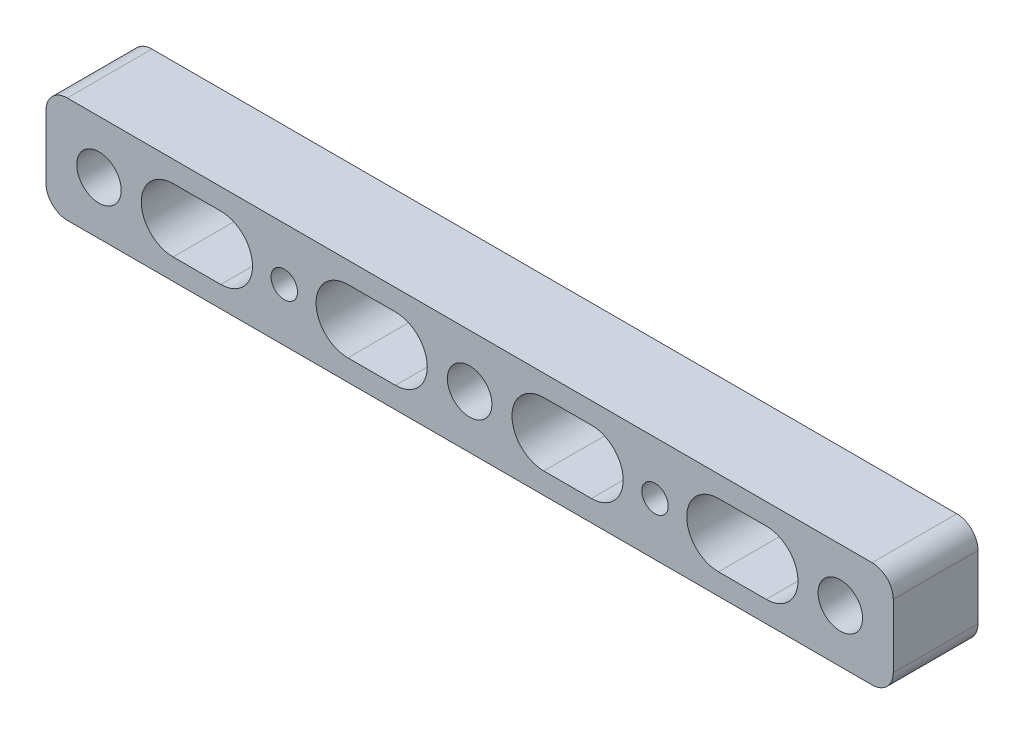
ISO-10303-21;
HEADER;
FILE_DESCRIPTION(('STEP AP214'),'2;1');
FILE_NAME('part.step','',(''),(''),'','','');
FILE_SCHEMA(('AUTOMOTIVE_DESIGN { 1 0 10303 214 1 1 1 1 }'));
ENDSEC;
DATA;
#1=APPLICATION_CONTEXT('core data for automotive mechanical design processes');
#2=APPLICATION_PROTOCOL_DEFINITION('international standard','automotive_design',2000,#1);
#3=PRODUCT_CONTEXT('',#1,'mechanical');
#4=PRODUCT('Part','Part','',(#3));
#5=PRODUCT_RELATED_PRODUCT_CATEGORY('part','',(#4));
#6=PRODUCT_DEFINITION_FORMATION('','',#4);
#7=PRODUCT_DEFINITION_CONTEXT('part definition',#1,'design');
#8=PRODUCT_DEFINITION('design','',#6,#7);
#9=PRODUCT_DEFINITION_SHAPE('','',#8);
#10=(LENGTH_UNIT() NAMED_UNIT(*) SI_UNIT(.MILLI.,.METRE.));
#11=(NAMED_UNIT(*) PLANE_ANGLE_UNIT() SI_UNIT($,.RADIAN.));
#12=(NAMED_UNIT(*) SI_UNIT($,.STERADIAN.) SOLID_ANGLE_UNIT());
#13=UNCERTAINTY_MEASURE_WITH_UNIT(LENGTH_MEASURE(1.E-05),#10,'distance_accuracy_value','');
#14=(GEOMETRIC_REPRESENTATION_CONTEXT(3) GLOBAL_UNCERTAINTY_ASSIGNED_CONTEXT((#13)) GLOBAL_UNIT_ASSIGNED_CONTEXT((#10,
#11,#12)) REPRESENTATION_CONTEXT('',''));
#15=CARTESIAN_POINT('',(0.,0.,0.));
#16=DIRECTION('',(0.,0.,1.));
#17=DIRECTION('',(1.,0.,0.));
#18=AXIS2_PLACEMENT_3D('',#15,#16,#17);
#19=CARTESIAN_POINT('',(40.,-5.,8.));
#20=DIRECTION('',(-1.,0.,0.));
#21=DIRECTION('',(0.,0.,1.));
#22=AXIS2_PLACEMENT_3D('',#19,#20,#21);
#23=PLANE('',#22);
#24=DIRECTION('',(0.,1.,0.));
#25=VECTOR('',#24,1.);
#26=CARTESIAN_POINT('',(40.,-5.,8.));
#27=LINE('',#26,#25);
#28=CARTESIAN_POINT('',(40.,-3.,8.));
#29=VERTEX_POINT('',#28);
#30=CARTESIAN_POINT('',(40.,3.,8.));
#31=VERTEX_POINT('',#30);
#32=EDGE_CURVE('E311',#29,#31,#27,.T.);
#33=ORIENTED_EDGE('',*,*,#32,.F.);
#34=DIRECTION('',(0.,0.,-1.));
#35=VECTOR('',#34,1.);
#36=CARTESIAN_POINT('',(40.,-3.,8.));
#37=LINE('',#36,#35);
#38=CARTESIAN_POINT('',(40.,-3.,0.));
#39=VERTEX_POINT('',#38);
#40=EDGE_CURVE('E345',#29,#39,#37,.T.);
#41=ORIENTED_EDGE('',*,*,#40,.T.);
#42=DIRECTION('',(0.,1.,0.));
#43=VECTOR('',#42,1.);
#44=CARTESIAN_POINT('',(40.,-5.,0.));
#45=LINE('',#44,#43);
#46=CARTESIAN_POINT('',(40.,3.,0.));
#47=VERTEX_POINT('',#46);
#48=EDGE_CURVE('E325',#39,#47,#45,.T.);
#49=ORIENTED_EDGE('',*,*,#48,.T.);
#50=DIRECTION('',(0.,0.,-1.));
#51=VECTOR('',#50,1.);
#52=CARTESIAN_POINT('',(40.,3.,8.));
#53=LINE('',#52,#51);
#54=EDGE_CURVE('E324',#47,#31,#53,.F.);
#55=ORIENTED_EDGE('',*,*,#54,.T.);
#56=EDGE_LOOP('',(#33,#41,#49,#55));
#57=FACE_BOUND('',#56,.T.);
#58=ADVANCED_FACE('F38',(#57),#23,.F.);
#59=CARTESIAN_POINT('',(-40.,5.,8.));
#60=DIRECTION('',(0.,-1.,0.));
#61=DIRECTION('',(0.,0.,-1.));
#62=AXIS2_PLACEMENT_3D('',#59,#60,#61);
#63=PLANE('',#62);
#64=DIRECTION('',(-1.,0.,0.));
#65=VECTOR('',#64,1.);
#66=CARTESIAN_POINT('',(-40.,5.,8.));
#67=LINE('',#66,#65);
#68=CARTESIAN_POINT('',(38.,5.,8.));
#69=VERTEX_POINT('',#68);
#70=CARTESIAN_POINT('',(-38.,5.,8.));
#71=VERTEX_POINT('',#70);
#72=EDGE_CURVE('E314',#69,#71,#67,.T.);
#73=ORIENTED_EDGE('',*,*,#72,.F.);
#74=DIRECTION('',(0.,0.,-1.));
#75=VECTOR('',#74,1.);
#76=CARTESIAN_POINT('',(38.,5.,8.));
#77=LINE('',#76,#75);
#78=CARTESIAN_POINT('',(38.,5.,0.));
#79=VERTEX_POINT('',#78);
#80=EDGE_CURVE('E371',#69,#79,#77,.T.);
#81=ORIENTED_EDGE('',*,*,#80,.T.);
#82=DIRECTION('',(-1.,0.,0.));
#83=VECTOR('',#82,1.);
#84=CARTESIAN_POINT('',(-40.,5.,0.));
#85=LINE('',#84,#83);
#86=CARTESIAN_POINT('',(-38.,5.,0.));
#87=VERTEX_POINT('',#86);
#88=EDGE_CURVE('E328',#79,#87,#85,.T.);
#89=ORIENTED_EDGE('',*,*,#88,.T.);
#90=DIRECTION('',(0.,0.,-1.));
#91=VECTOR('',#90,1.);
#92=CARTESIAN_POINT('',(-38.,5.,8.));
#93=LINE('',#92,#91);
#94=EDGE_CURVE('E369',#87,#71,#93,.F.);
#95=ORIENTED_EDGE('',*,*,#94,.T.);
#96=EDGE_LOOP('',(#73,#81,#89,#95));
#97=FACE_BOUND('',#96,.T.);
#98=ADVANCED_FACE('F431',(#97),#63,.F.);
#99=CARTESIAN_POINT('',(-40.,-5.,8.));
#100=DIRECTION('',(1.,0.,0.));
#101=DIRECTION('',(0.,0.,-1.));
#102=AXIS2_PLACEMENT_3D('',#99,#100,#101);
#103=PLANE('',#102);
#104=DIRECTION('',(0.,-1.,0.));
#105=VECTOR('',#104,1.);
#106=CARTESIAN_POINT('',(-40.,-5.,8.));
#107=LINE('',#106,#105);
#108=CARTESIAN_POINT('',(-40.,3.,8.));
#109=VERTEX_POINT('',#108);
#110=CARTESIAN_POINT('',(-40.,-3.,8.));
#111=VERTEX_POINT('',#110);
#112=EDGE_CURVE('E318',#109,#111,#107,.T.);
#113=ORIENTED_EDGE('',*,*,#112,.F.);
#114=DIRECTION('',(0.,0.,-1.));
#115=VECTOR('',#114,1.);
#116=CARTESIAN_POINT('',(-40.,3.,8.));
#117=LINE('',#116,#115);
#118=CARTESIAN_POINT('',(-40.,3.,0.));
#119=VERTEX_POINT('',#118);
#120=EDGE_CURVE('E376',#109,#119,#117,.T.);
#121=ORIENTED_EDGE('',*,*,#120,.T.);
#122=DIRECTION('',(0.,-1.,0.));
#123=VECTOR('',#122,1.);
#124=CARTESIAN_POINT('',(-40.,-5.,0.));
#125=LINE('',#124,#123);
#126=CARTESIAN_POINT('',(-40.,-3.,0.));
#127=VERTEX_POINT('',#126);
#128=EDGE_CURVE('E331',#119,#127,#125,.T.);
#129=ORIENTED_EDGE('',*,*,#128,.T.);
#130=DIRECTION('',(0.,0.,-1.));
#131=VECTOR('',#130,1.);
#132=CARTESIAN_POINT('',(-40.,-3.,8.));
#133=LINE('',#132,#131);
#134=EDGE_CURVE('E374',#127,#111,#133,.F.);
#135=ORIENTED_EDGE('',*,*,#134,.T.);
#136=EDGE_LOOP('',(#113,#121,#129,#135));
#137=FACE_BOUND('',#136,.T.);
#138=ADVANCED_FACE('F437',(#137),#103,.F.);
#139=CARTESIAN_POINT('',(-40.,-5.,8.));
#140=DIRECTION('',(0.,1.,0.));
#141=DIRECTION('',(0.,0.,1.));
#142=AXIS2_PLACEMENT_3D('',#139,#140,#141);
#143=PLANE('',#142);
#144=DIRECTION('',(1.,0.,0.));
#145=VECTOR('',#144,1.);
#146=CARTESIAN_POINT('',(-40.,-5.,0.));
#147=LINE('',#146,#145);
#148=CARTESIAN_POINT('',(-38.,-5.,0.));
#149=VERTEX_POINT('',#148);
#150=CARTESIAN_POINT('',(38.,-5.,0.));
#151=VERTEX_POINT('',#150);
#152=EDGE_CURVE('E315',#149,#151,#147,.T.);
#153=ORIENTED_EDGE('',*,*,#152,.T.);
#154=DIRECTION('',(0.,0.,-1.));
#155=VECTOR('',#154,1.);
#156=CARTESIAN_POINT('',(38.,-5.,8.));
#157=LINE('',#156,#155);
#158=CARTESIAN_POINT('',(38.,-5.,8.));
#159=VERTEX_POINT('',#158);
#160=EDGE_CURVE('E359',#151,#159,#157,.F.);
#161=ORIENTED_EDGE('',*,*,#160,.T.);
#162=DIRECTION('',(1.,0.,0.));
#163=VECTOR('',#162,1.);
#164=CARTESIAN_POINT('',(-40.,-5.,8.));
#165=LINE('',#164,#163);
#166=CARTESIAN_POINT('',(-38.,-5.,8.));
#167=VERTEX_POINT('',#166);
#168=EDGE_CURVE('E321',#167,#159,#165,.T.);
#169=ORIENTED_EDGE('',*,*,#168,.F.);
#170=DIRECTION('',(0.,0.,-1.));
#171=VECTOR('',#170,1.);
#172=CARTESIAN_POINT('',(-38.,-5.,8.));
#173=LINE('',#172,#171);
#174=EDGE_CURVE('E356',#167,#149,#173,.T.);
#175=ORIENTED_EDGE('',*,*,#174,.T.);
#176=EDGE_LOOP('',(#153,#161,#169,#175));
#177=FACE_BOUND('',#176,.T.);
#178=ADVANCED_FACE('F473',(#177),#143,.F.);
#179=CARTESIAN_POINT('',(0.,0.,8.));
#180=DIRECTION('',(0.,0.,-1.));
#181=DIRECTION('',(-1.,0.,0.));
#182=AXIS2_PLACEMENT_3D('',#179,#180,#181);
#183=PLANE('',#182);
#184=DIRECTION('',(1.,0.,0.));
#185=VECTOR('',#184,1.);
#186=CARTESIAN_POINT('',(-28.,-3.,8.));
#187=LINE('',#186,#185);
#188=CARTESIAN_POINT('',(-28.,-3.,8.));
#189=VERTEX_POINT('',#188);
#190=CARTESIAN_POINT('',(-23.5,-3.,8.));
#191=VERTEX_POINT('',#190);
#192=EDGE_CURVE('E215',#189,#191,#187,.T.);
#193=ORIENTED_EDGE('',*,*,#192,.F.);
#194=CARTESIAN_POINT('',(-28.,0.,8.));
#195=DIRECTION('',(0.,0.,1.));
#196=DIRECTION('',(1.,0.,0.));
#197=AXIS2_PLACEMENT_3D('',#194,#195,#196);
#198=CIRCLE('',#197,3.);
#199=CARTESIAN_POINT('',(-28.,3.,8.));
#200=VERTEX_POINT('',#199);
#201=EDGE_CURVE('E53',#200,#189,#198,.T.);
#202=ORIENTED_EDGE('',*,*,#201,.F.);
#203=DIRECTION('',(-1.,0.,0.));
#204=VECTOR('',#203,1.);
#205=CARTESIAN_POINT('',(-28.,3.,8.));
#206=LINE('',#205,#204);
#207=CARTESIAN_POINT('',(-23.5,3.,8.));
#208=VERTEX_POINT('',#207);
#209=EDGE_CURVE('E222',#208,#200,#206,.T.);
#210=ORIENTED_EDGE('',*,*,#209,.F.);
#211=CARTESIAN_POINT('',(-23.5,0.,8.));
#212=DIRECTION('',(0.,0.,1.));
#213=DIRECTION('',(1.,0.,0.));
#214=AXIS2_PLACEMENT_3D('',#211,#212,#213);
#215=CIRCLE('',#214,3.);
#216=EDGE_CURVE('E205',#191,#208,#215,.T.);
#217=ORIENTED_EDGE('',*,*,#216,.F.);
#218=EDGE_LOOP('',(#193,#202,#210,#217));
#219=FACE_BOUND('',#218,.T.);
#220=DIRECTION('',(-1.,0.,0.));
#221=VECTOR('',#220,1.);
#222=CARTESIAN_POINT('',(-7.,3.,8.));
#223=LINE('',#222,#221);
#224=CARTESIAN_POINT('',(-7.,3.,8.));
#225=VERTEX_POINT('',#224);
#226=CARTESIAN_POINT('',(-11.5,3.,8.));
#227=VERTEX_POINT('',#226);
#228=EDGE_CURVE('E233',#225,#227,#223,.T.);
#229=ORIENTED_EDGE('',*,*,#228,.F.);
#230=CARTESIAN_POINT('',(-7.,0.,8.));
#231=DIRECTION('',(0.,0.,1.));
#232=DIRECTION('',(-1.,0.,0.));
#233=AXIS2_PLACEMENT_3D('',#230,#231,#232);
#234=CIRCLE('',#233,3.);
#235=CARTESIAN_POINT('',(-7.,-3.,8.));
#236=VERTEX_POINT('',#235);
#237=EDGE_CURVE('E61',#236,#225,#234,.T.);
#238=ORIENTED_EDGE('',*,*,#237,.F.);
#239=DIRECTION('',(1.,0.,0.));
#240=VECTOR('',#239,1.);
#241=CARTESIAN_POINT('',(-7.,-3.,8.));
#242=LINE('',#241,#240);
#243=CARTESIAN_POINT('',(-11.5,-3.,8.));
#244=VERTEX_POINT('',#243);
#245=EDGE_CURVE('E240',#244,#236,#242,.T.);
#246=ORIENTED_EDGE('',*,*,#245,.F.);
#247=CARTESIAN_POINT('',(-11.5,0.,8.));
#248=DIRECTION('',(0.,0.,1.));
#249=DIRECTION('',(-1.,0.,0.));
#250=AXIS2_PLACEMENT_3D('',#247,#248,#249);
#251=CIRCLE('',#250,3.);
#252=EDGE_CURVE('E237',#227,#244,#251,.T.);
#253=ORIENTED_EDGE('',*,*,#252,.F.);
#254=EDGE_LOOP('',(#229,#238,#246,#253));
#255=FACE_BOUND('',#254,.T.);
#256=DIRECTION('',(1.,0.,0.));
#257=VECTOR('',#256,1.);
#258=CARTESIAN_POINT('',(7.,-3.,8.));
#259=LINE('',#258,#257);
#260=CARTESIAN_POINT('',(7.,-3.,8.));
#261=VERTEX_POINT('',#260);
#262=CARTESIAN_POINT('',(11.5,-3.,8.));
#263=VERTEX_POINT('',#262);
#264=EDGE_CURVE('E253',#261,#263,#259,.T.);
#265=ORIENTED_EDGE('',*,*,#264,.F.);
#266=CARTESIAN_POINT('',(7.,0.,8.));
#267=DIRECTION('',(0.,0.,1.));
#268=DIRECTION('',(1.,0.,0.));
#269=AXIS2_PLACEMENT_3D('',#266,#267,#268);
#270=CIRCLE('',#269,3.);
#271=CARTESIAN_POINT('',(7.,3.,8.));
#272=VERTEX_POINT('',#271);
#273=EDGE_CURVE('E251',#272,#261,#270,.T.);
#274=ORIENTED_EDGE('',*,*,#273,.F.);
#275=DIRECTION('',(-1.,0.,0.));
#276=VECTOR('',#275,1.);
#277=CARTESIAN_POINT('',(7.,3.,8.));
#278=LINE('',#277,#276);
#279=CARTESIAN_POINT('',(11.5,3.,8.));
#280=VERTEX_POINT('',#279);
#281=EDGE_CURVE('E260',#280,#272,#278,.T.);
#282=ORIENTED_EDGE('',*,*,#281,.F.);
#283=CARTESIAN_POINT('',(11.5,0.,8.));
#284=DIRECTION('',(0.,0.,1.));
#285=DIRECTION('',(1.,0.,0.));
#286=AXIS2_PLACEMENT_3D('',#283,#284,#285);
#287=CIRCLE('',#286,3.);
#288=EDGE_CURVE('E257',#263,#280,#287,.T.);
#289=ORIENTED_EDGE('',*,*,#288,.F.);
#290=EDGE_LOOP('',(#265,#274,#282,#289));
#291=FACE_BOUND('',#290,.T.);
#292=DIRECTION('',(-1.,0.,0.));
#293=VECTOR('',#292,1.);
#294=CARTESIAN_POINT('',(28.,3.,8.));
#295=LINE('',#294,#293);
#296=CARTESIAN_POINT('',(28.,3.,8.));
#297=VERTEX_POINT('',#296);
#298=CARTESIAN_POINT('',(23.5,3.,8.));
#299=VERTEX_POINT('',#298);
#300=EDGE_CURVE('E273',#297,#299,#295,.T.);
#301=ORIENTED_EDGE('',*,*,#300,.F.);
#302=CARTESIAN_POINT('',(28.,0.,8.));
#303=DIRECTION('',(0.,0.,1.));
#304=DIRECTION('',(-1.,0.,0.));
#305=AXIS2_PLACEMENT_3D('',#302,#303,#304);
#306=CIRCLE('',#305,3.);
#307=CARTESIAN_POINT('',(28.,-3.,8.));
#308=VERTEX_POINT('',#307);
#309=EDGE_CURVE('E271',#308,#297,#306,.T.);
#310=ORIENTED_EDGE('',*,*,#309,.F.);
#311=DIRECTION('',(1.,0.,0.));
#312=VECTOR('',#311,1.);
#313=CARTESIAN_POINT('',(28.,-3.,8.));
#314=LINE('',#313,#312);
#315=CARTESIAN_POINT('',(23.5,-3.,8.));
#316=VERTEX_POINT('',#315);
#317=EDGE_CURVE('E279',#316,#308,#314,.T.);
#318=ORIENTED_EDGE('',*,*,#317,.F.);
#319=CARTESIAN_POINT('',(23.5,0.,8.));
#320=DIRECTION('',(0.,0.,1.));
#321=DIRECTION('',(-1.,0.,0.));
#322=AXIS2_PLACEMENT_3D('',#319,#320,#321);
#323=CIRCLE('',#322,3.);
#324=EDGE_CURVE('E276',#299,#316,#323,.T.);
#325=ORIENTED_EDGE('',*,*,#324,.F.);
#326=EDGE_LOOP('',(#301,#310,#318,#325));
#327=FACE_BOUND('',#326,.T.);
#328=CARTESIAN_POINT('',(-17.5,0.,8.));
#329=DIRECTION('',(0.,0.,1.));
#330=DIRECTION('',(1.,0.,0.));
#331=AXIS2_PLACEMENT_3D('',#328,#329,#330);
#332=CIRCLE('',#331,1.25);
#333=CARTESIAN_POINT('',(-16.25,0.,8.));
#334=VERTEX_POINT('',#333);
#335=EDGE_CURVE('E229',#334,#334,#332,.T.);
#336=ORIENTED_EDGE('',*,*,#335,.F.);
#337=EDGE_LOOP('',(#336));
#338=FACE_BOUND('',#337,.T.);
#339=CARTESIAN_POINT('',(17.5,0.,8.));
#340=DIRECTION('',(0.,0.,1.));
#341=DIRECTION('',(1.,0.,0.));
#342=AXIS2_PLACEMENT_3D('',#339,#340,#341);
#343=CIRCLE('',#342,1.25);
#344=CARTESIAN_POINT('',(18.75,0.,8.));
#345=VERTEX_POINT('',#344);
#346=EDGE_CURVE('E293',#345,#345,#343,.T.);
#347=ORIENTED_EDGE('',*,*,#346,.F.);
#348=EDGE_LOOP('',(#347));
#349=FACE_BOUND('',#348,.T.);
#350=CARTESIAN_POINT('',(-35.,0.,8.));
#351=DIRECTION('',(0.,0.,1.));
#352=DIRECTION('',(1.,0.,0.));
#353=AXIS2_PLACEMENT_3D('',#350,#351,#352);
#354=CIRCLE('',#353,2.09999999999999);
#355=CARTESIAN_POINT('',(-32.9,0.,8.));
#356=VERTEX_POINT('',#355);
#357=EDGE_CURVE('E297',#356,#356,#354,.T.);
#358=ORIENTED_EDGE('',*,*,#357,.F.);
#359=EDGE_LOOP('',(#358));
#360=FACE_BOUND('',#359,.T.);
#361=CARTESIAN_POINT('',(0.,0.,8.));
#362=DIRECTION('',(0.,0.,1.));
#363=DIRECTION('',(1.,0.,0.));
#364=AXIS2_PLACEMENT_3D('',#361,#362,#363);
#365=CIRCLE('',#364,2.09999999999999);
#366=CARTESIAN_POINT('',(2.09999999999999,0.,8.));
#367=VERTEX_POINT('',#366);
#368=EDGE_CURVE('E301',#367,#367,#365,.T.);
#369=ORIENTED_EDGE('',*,*,#368,.F.);
#370=EDGE_LOOP('',(#369));
#371=FACE_BOUND('',#370,.T.);
#372=CARTESIAN_POINT('',(35.,0.,8.));
#373=DIRECTION('',(0.,0.,1.));
#374=DIRECTION('',(1.,0.,0.));
#375=AXIS2_PLACEMENT_3D('',#372,#373,#374);
#376=CIRCLE('',#375,2.09999999999999);
#377=CARTESIAN_POINT('',(37.1,0.,8.));
#378=VERTEX_POINT('',#377);
#379=EDGE_CURVE('E307',#378,#378,#376,.T.);
#380=ORIENTED_EDGE('',*,*,#379,.F.);
#381=EDGE_LOOP('',(#380));
#382=FACE_BOUND('',#381,.T.);
#383=ORIENTED_EDGE('',*,*,#168,.T.);
#384=CARTESIAN_POINT('',(38.,-3.,8.));
#385=DIRECTION('',(0.,0.,-1.));
#386=DIRECTION('',(-1.,0.,0.));
#387=AXIS2_PLACEMENT_3D('',#384,#385,#386);
#388=CIRCLE('',#387,2.);
#389=EDGE_CURVE('E367',#159,#29,#388,.F.);
#390=ORIENTED_EDGE('',*,*,#389,.T.);
#391=ORIENTED_EDGE('',*,*,#32,.T.);
#392=CARTESIAN_POINT('',(38.,3.,8.));
#393=DIRECTION('',(0.,0.,-1.));
#394=DIRECTION('',(-1.,0.,0.));
#395=AXIS2_PLACEMENT_3D('',#392,#393,#394);
#396=CIRCLE('',#395,2.);
#397=EDGE_CURVE('E365',#31,#69,#396,.F.);
#398=ORIENTED_EDGE('',*,*,#397,.T.);
#399=ORIENTED_EDGE('',*,*,#72,.T.);
#400=CARTESIAN_POINT('',(-38.,3.,8.));
#401=DIRECTION('',(0.,0.,-1.));
#402=DIRECTION('',(-1.,0.,0.));
#403=AXIS2_PLACEMENT_3D('',#400,#401,#402);
#404=CIRCLE('',#403,2.);
#405=EDGE_CURVE('E363',#71,#109,#404,.F.);
#406=ORIENTED_EDGE('',*,*,#405,.T.);
#407=ORIENTED_EDGE('',*,*,#112,.T.);
#408=CARTESIAN_POINT('',(-38.,-3.,8.));
#409=DIRECTION('',(0.,0.,-1.));
#410=DIRECTION('',(-1.,0.,0.));
#411=AXIS2_PLACEMENT_3D('',#408,#409,#410);
#412=CIRCLE('',#411,2.);
#413=EDGE_CURVE('E361',#111,#167,#412,.F.);
#414=ORIENTED_EDGE('',*,*,#413,.T.);
#415=EDGE_LOOP('',(#383,#390,#391,#398,#399,#406,#407,#414));
#416=FACE_BOUND('',#415,.T.);
#417=ADVANCED_FACE('F219',(#219,#255,#291,#327,#338,#349,#360,#371,#382,#416),#183,.F.);
#418=CARTESIAN_POINT('',(0.,0.,0.));
#419=DIRECTION('',(0.,0.,-1.));
#420=DIRECTION('',(-1.,0.,0.));
#421=AXIS2_PLACEMENT_3D('',#418,#419,#420);
#422=PLANE('',#421);
#423=CARTESIAN_POINT('',(-28.,0.,0.));
#424=DIRECTION('',(0.,0.,-1.));
#425=DIRECTION('',(-1.,0.,0.));
#426=AXIS2_PLACEMENT_3D('',#423,#424,#425);
#427=CIRCLE('',#426,3.);
#428=CARTESIAN_POINT('',(-28.,-3.,0.));
#429=VERTEX_POINT('',#428);
#430=CARTESIAN_POINT('',(-28.,3.,0.));
#431=VERTEX_POINT('',#430);
#432=EDGE_CURVE('E11',#429,#431,#427,.T.);
#433=ORIENTED_EDGE('',*,*,#432,.F.);
#434=DIRECTION('',(-1.,0.,0.));
#435=VECTOR('',#434,1.);
#436=CARTESIAN_POINT('',(0.,-2.99999999999999,0.));
#437=LINE('',#436,#435);
#438=CARTESIAN_POINT('',(-23.5,-3.,0.));
#439=VERTEX_POINT('',#438);
#440=EDGE_CURVE('E406',#439,#429,#437,.T.);
#441=ORIENTED_EDGE('',*,*,#440,.F.);
#442=CARTESIAN_POINT('',(-23.5,0.,0.));
#443=DIRECTION('',(0.,0.,-1.));
#444=DIRECTION('',(-1.,0.,0.));
#445=AXIS2_PLACEMENT_3D('',#442,#443,#444);
#446=CIRCLE('',#445,3.);
#447=CARTESIAN_POINT('',(-23.5,3.,0.));
#448=VERTEX_POINT('',#447);
#449=EDGE_CURVE('E208',#448,#439,#446,.T.);
#450=ORIENTED_EDGE('',*,*,#449,.F.);
#451=DIRECTION('',(1.,0.,0.));
#452=VECTOR('',#451,1.);
#453=CARTESIAN_POINT('',(0.,3.,0.));
#454=LINE('',#453,#452);
#455=EDGE_CURVE('E46',#431,#448,#454,.T.);
#456=ORIENTED_EDGE('',*,*,#455,.F.);
#457=EDGE_LOOP('',(#433,#441,#450,#456));
#458=FACE_BOUND('',#457,.T.);
#459=CARTESIAN_POINT('',(-7.,0.,0.));
#460=DIRECTION('',(0.,0.,-1.));
#461=DIRECTION('',(-1.,0.,0.));
#462=AXIS2_PLACEMENT_3D('',#459,#460,#461);
#463=CIRCLE('',#462,3.);
#464=CARTESIAN_POINT('',(-7.,3.,0.));
#465=VERTEX_POINT('',#464);
#466=CARTESIAN_POINT('',(-7.,-3.,0.));
#467=VERTEX_POINT('',#466);
#468=EDGE_CURVE('E404',#465,#467,#463,.T.);
#469=ORIENTED_EDGE('',*,*,#468,.F.);
#470=DIRECTION('',(1.,0.,0.));
#471=VECTOR('',#470,1.);
#472=CARTESIAN_POINT('',(0.,3.,0.));
#473=LINE('',#472,#471);
#474=CARTESIAN_POINT('',(-11.5,3.,0.));
#475=VERTEX_POINT('',#474);
#476=EDGE_CURVE('E397',#475,#465,#473,.T.);
#477=ORIENTED_EDGE('',*,*,#476,.F.);
#478=CARTESIAN_POINT('',(-11.5,0.,0.));
#479=DIRECTION('',(0.,0.,-1.));
#480=DIRECTION('',(-1.,0.,0.));
#481=AXIS2_PLACEMENT_3D('',#478,#479,#480);
#482=CIRCLE('',#481,3.);
#483=CARTESIAN_POINT('',(-11.5,-3.,0.));
#484=VERTEX_POINT('',#483);
#485=EDGE_CURVE('E399',#484,#475,#482,.T.);
#486=ORIENTED_EDGE('',*,*,#485,.F.);
#487=DIRECTION('',(-1.,0.,0.));
#488=VECTOR('',#487,1.);
#489=CARTESIAN_POINT('',(0.,-3.,0.));
#490=LINE('',#489,#488);
#491=EDGE_CURVE('E402',#467,#484,#490,.T.);
#492=ORIENTED_EDGE('',*,*,#491,.F.);
#493=EDGE_LOOP('',(#469,#477,#486,#492));
#494=FACE_BOUND('',#493,.T.);
#495=CARTESIAN_POINT('',(7.,0.,0.));
#496=DIRECTION('',(0.,0.,-1.));
#497=DIRECTION('',(-1.,0.,0.));
#498=AXIS2_PLACEMENT_3D('',#495,#496,#497);
#499=CIRCLE('',#498,3.);
#500=CARTESIAN_POINT('',(7.,-3.,0.));
#501=VERTEX_POINT('',#500);
#502=CARTESIAN_POINT('',(7.,3.,0.));
#503=VERTEX_POINT('',#502);
#504=EDGE_CURVE('E395',#501,#503,#499,.T.);
#505=ORIENTED_EDGE('',*,*,#504,.F.);
#506=DIRECTION('',(-1.,0.,0.));
#507=VECTOR('',#506,1.);
#508=CARTESIAN_POINT('',(0.,-3.,0.));
#509=LINE('',#508,#507);
#510=CARTESIAN_POINT('',(11.5,-3.,0.));
#511=VERTEX_POINT('',#510);
#512=EDGE_CURVE('E388',#511,#501,#509,.T.);
#513=ORIENTED_EDGE('',*,*,#512,.F.);
#514=CARTESIAN_POINT('',(11.5,0.,0.));
#515=DIRECTION('',(0.,0.,-1.));
#516=DIRECTION('',(-1.,0.,0.));
#517=AXIS2_PLACEMENT_3D('',#514,#515,#516);
#518=CIRCLE('',#517,3.);
#519=CARTESIAN_POINT('',(11.5,3.,0.));
#520=VERTEX_POINT('',#519);
#521=EDGE_CURVE('E390',#520,#511,#518,.T.);
#522=ORIENTED_EDGE('',*,*,#521,.F.);
#523=DIRECTION('',(1.,0.,0.));
#524=VECTOR('',#523,1.);
#525=CARTESIAN_POINT('',(0.,3.,0.));
#526=LINE('',#525,#524);
#527=EDGE_CURVE('E393',#503,#520,#526,.T.);
#528=ORIENTED_EDGE('',*,*,#527,.F.);
#529=EDGE_LOOP('',(#505,#513,#522,#528));
#530=FACE_BOUND('',#529,.T.);
#531=CARTESIAN_POINT('',(28.,0.,0.));
#532=DIRECTION('',(0.,0.,-1.));
#533=DIRECTION('',(-1.,0.,0.));
#534=AXIS2_PLACEMENT_3D('',#531,#532,#533);
#535=CIRCLE('',#534,3.);
#536=CARTESIAN_POINT('',(28.,3.,0.));
#537=VERTEX_POINT('',#536);
#538=CARTESIAN_POINT('',(28.,-3.,0.));
#539=VERTEX_POINT('',#538);
#540=EDGE_CURVE('E386',#537,#539,#535,.T.);
#541=ORIENTED_EDGE('',*,*,#540,.F.);
#542=DIRECTION('',(1.,0.,0.));
#543=VECTOR('',#542,1.);
#544=CARTESIAN_POINT('',(0.,3.,0.));
#545=LINE('',#544,#543);
#546=CARTESIAN_POINT('',(23.5,3.,0.));
#547=VERTEX_POINT('',#546);
#548=EDGE_CURVE('E379',#547,#537,#545,.T.);
#549=ORIENTED_EDGE('',*,*,#548,.F.);
#550=CARTESIAN_POINT('',(23.5,0.,0.));
#551=DIRECTION('',(0.,0.,-1.));
#552=DIRECTION('',(-1.,0.,0.));
#553=AXIS2_PLACEMENT_3D('',#550,#551,#552);
#554=CIRCLE('',#553,3.);
#555=CARTESIAN_POINT('',(23.5,-3.,0.));
#556=VERTEX_POINT('',#555);
#557=EDGE_CURVE('E381',#556,#547,#554,.T.);
#558=ORIENTED_EDGE('',*,*,#557,.F.);
#559=DIRECTION('',(-1.,0.,0.));
#560=VECTOR('',#559,1.);
#561=CARTESIAN_POINT('',(0.,-2.99999999999999,0.));
#562=LINE('',#561,#560);
#563=EDGE_CURVE('E384',#539,#556,#562,.T.);
#564=ORIENTED_EDGE('',*,*,#563,.F.);
#565=EDGE_LOOP('',(#541,#549,#558,#564));
#566=FACE_BOUND('',#565,.T.);
#567=CARTESIAN_POINT('',(-17.5,0.,0.));
#568=DIRECTION('',(0.,0.,-1.));
#569=DIRECTION('',(-1.,0.,0.));
#570=AXIS2_PLACEMENT_3D('',#567,#568,#569);
#571=CIRCLE('',#570,1.25);
#572=CARTESIAN_POINT('',(-18.75,0.,0.));
#573=VERTEX_POINT('',#572);
#574=EDGE_CURVE('E292',#573,#573,#571,.T.);
#575=ORIENTED_EDGE('',*,*,#574,.F.);
#576=EDGE_LOOP('',(#575));
#577=FACE_BOUND('',#576,.T.);
#578=CARTESIAN_POINT('',(17.5,0.,0.));
#579=DIRECTION('',(0.,0.,-1.));
#580=DIRECTION('',(-1.,0.,0.));
#581=AXIS2_PLACEMENT_3D('',#578,#579,#580);
#582=CIRCLE('',#581,1.25);
#583=CARTESIAN_POINT('',(16.25,0.,0.));
#584=VERTEX_POINT('',#583);
#585=EDGE_CURVE('E296',#584,#584,#582,.T.);
#586=ORIENTED_EDGE('',*,*,#585,.F.);
#587=EDGE_LOOP('',(#586));
#588=FACE_BOUND('',#587,.T.);
#589=CARTESIAN_POINT('',(-35.,0.,0.));
#590=DIRECTION('',(0.,0.,-1.));
#591=DIRECTION('',(-1.,0.,0.));
#592=AXIS2_PLACEMENT_3D('',#589,#590,#591);
#593=CIRCLE('',#592,2.09999999999999);
#594=CARTESIAN_POINT('',(-37.1,0.,0.));
#595=VERTEX_POINT('',#594);
#596=EDGE_CURVE('E300',#595,#595,#593,.T.);
#597=ORIENTED_EDGE('',*,*,#596,.F.);
#598=EDGE_LOOP('',(#597));
#599=FACE_BOUND('',#598,.T.);
#600=CARTESIAN_POINT('',(0.,0.,0.));
#601=DIRECTION('',(0.,0.,-1.));
#602=DIRECTION('',(-1.,0.,0.));
#603=AXIS2_PLACEMENT_3D('',#600,#601,#602);
#604=CIRCLE('',#603,2.09999999999999);
#605=CARTESIAN_POINT('',(-2.09999999999999,0.,0.));
#606=VERTEX_POINT('',#605);
#607=EDGE_CURVE('E304',#606,#606,#604,.T.);
#608=ORIENTED_EDGE('',*,*,#607,.F.);
#609=EDGE_LOOP('',(#608));
#610=FACE_BOUND('',#609,.T.);
#611=CARTESIAN_POINT('',(35.,0.,0.));
#612=DIRECTION('',(0.,0.,-1.));
#613=DIRECTION('',(-1.,0.,0.));
#614=AXIS2_PLACEMENT_3D('',#611,#612,#613);
#615=CIRCLE('',#614,2.09999999999999);
#616=CARTESIAN_POINT('',(32.9,0.,0.));
#617=VERTEX_POINT('',#616);
#618=EDGE_CURVE('E310',#617,#617,#615,.T.);
#619=ORIENTED_EDGE('',*,*,#618,.F.);
#620=EDGE_LOOP('',(#619));
#621=FACE_BOUND('',#620,.T.);
#622=ORIENTED_EDGE('',*,*,#48,.F.);
#623=CARTESIAN_POINT('',(38.,-3.,0.));
#624=DIRECTION('',(0.,0.,-1.));
#625=DIRECTION('',(-1.,0.,0.));
#626=AXIS2_PLACEMENT_3D('',#623,#624,#625);
#627=CIRCLE('',#626,2.);
#628=EDGE_CURVE('E354',#39,#151,#627,.T.);
#629=ORIENTED_EDGE('',*,*,#628,.T.);
#630=ORIENTED_EDGE('',*,*,#152,.F.);
#631=CARTESIAN_POINT('',(-38.,-3.,0.));
#632=DIRECTION('',(0.,0.,-1.));
#633=DIRECTION('',(-1.,0.,0.));
#634=AXIS2_PLACEMENT_3D('',#631,#632,#633);
#635=CIRCLE('',#634,2.);
#636=EDGE_CURVE('E348',#149,#127,#635,.T.);
#637=ORIENTED_EDGE('',*,*,#636,.T.);
#638=ORIENTED_EDGE('',*,*,#128,.F.);
#639=CARTESIAN_POINT('',(-38.,3.,0.));
#640=DIRECTION('',(0.,0.,-1.));
#641=DIRECTION('',(-1.,0.,0.));
#642=AXIS2_PLACEMENT_3D('',#639,#640,#641);
#643=CIRCLE('',#642,2.);
#644=EDGE_CURVE('E350',#119,#87,#643,.T.);
#645=ORIENTED_EDGE('',*,*,#644,.T.);
#646=ORIENTED_EDGE('',*,*,#88,.F.);
#647=CARTESIAN_POINT('',(38.,3.,0.));
#648=DIRECTION('',(0.,0.,-1.));
#649=DIRECTION('',(-1.,0.,0.));
#650=AXIS2_PLACEMENT_3D('',#647,#648,#649);
#651=CIRCLE('',#650,2.);
#652=EDGE_CURVE('E352',#79,#47,#651,.T.);
#653=ORIENTED_EDGE('',*,*,#652,.T.);
#654=EDGE_LOOP('',(#622,#629,#630,#637,#638,#645,#646,#653));
#655=FACE_BOUND('',#654,.T.);
#656=ADVANCED_FACE('F414',(#458,#494,#530,#566,#577,#588,#599,#610,#621,#655),#422,.T.);
#657=CARTESIAN_POINT('',(35.,0.,8.));
#658=DIRECTION('',(0.,0.,1.));
#659=DIRECTION('',(1.,0.,0.));
#660=AXIS2_PLACEMENT_3D('',#657,#658,#659);
#661=CYLINDRICAL_SURFACE('',#660,2.09999999999999);
#662=ORIENTED_EDGE('',*,*,#618,.T.);
#663=EDGE_LOOP('',(#662));
#664=FACE_BOUND('',#663,.T.);
#665=ORIENTED_EDGE('',*,*,#379,.T.);
#666=EDGE_LOOP('',(#665));
#667=FACE_BOUND('',#666,.T.);
#668=ADVANCED_FACE('F484',(#664,#667),#661,.F.);
#669=CARTESIAN_POINT('',(0.,0.,8.));
#670=DIRECTION('',(0.,0.,1.));
#671=DIRECTION('',(1.,0.,0.));
#672=AXIS2_PLACEMENT_3D('',#669,#670,#671);
#673=CYLINDRICAL_SURFACE('',#672,2.09999999999999);
#674=ORIENTED_EDGE('',*,*,#607,.T.);
#675=EDGE_LOOP('',(#674));
#676=FACE_BOUND('',#675,.T.);
#677=ORIENTED_EDGE('',*,*,#368,.T.);
#678=EDGE_LOOP('',(#677));
#679=FACE_BOUND('',#678,.T.);
#680=ADVANCED_FACE('F490',(#676,#679),#673,.F.);
#681=CARTESIAN_POINT('',(-35.,0.,8.));
#682=DIRECTION('',(0.,0.,1.));
#683=DIRECTION('',(1.,0.,0.));
#684=AXIS2_PLACEMENT_3D('',#681,#682,#683);
#685=CYLINDRICAL_SURFACE('',#684,2.09999999999999);
#686=ORIENTED_EDGE('',*,*,#596,.T.);
#687=EDGE_LOOP('',(#686));
#688=FACE_BOUND('',#687,.T.);
#689=ORIENTED_EDGE('',*,*,#357,.T.);
#690=EDGE_LOOP('',(#689));
#691=FACE_BOUND('',#690,.T.);
#692=ADVANCED_FACE('F666',(#688,#691),#685,.F.);
#693=CARTESIAN_POINT('',(17.5,0.,8.));
#694=DIRECTION('',(0.,0.,1.));
#695=DIRECTION('',(1.,0.,0.));
#696=AXIS2_PLACEMENT_3D('',#693,#694,#695);
#697=CYLINDRICAL_SURFACE('',#696,1.25);
#698=ORIENTED_EDGE('',*,*,#585,.T.);
#699=EDGE_LOOP('',(#698));
#700=FACE_BOUND('',#699,.T.);
#701=ORIENTED_EDGE('',*,*,#346,.T.);
#702=EDGE_LOOP('',(#701));
#703=FACE_BOUND('',#702,.T.);
#704=ADVANCED_FACE('F662',(#700,#703),#697,.F.);
#705=CARTESIAN_POINT('',(-17.5,0.,8.));
#706=DIRECTION('',(0.,0.,1.));
#707=DIRECTION('',(1.,0.,0.));
#708=AXIS2_PLACEMENT_3D('',#705,#706,#707);
#709=CYLINDRICAL_SURFACE('',#708,1.25);
#710=ORIENTED_EDGE('',*,*,#574,.T.);
#711=EDGE_LOOP('',(#710));
#712=FACE_BOUND('',#711,.T.);
#713=ORIENTED_EDGE('',*,*,#335,.T.);
#714=EDGE_LOOP('',(#713));
#715=FACE_BOUND('',#714,.T.);
#716=ADVANCED_FACE('F447',(#712,#715),#709,.F.);
#717=CARTESIAN_POINT('',(38.,-3.,8.));
#718=DIRECTION('',(0.,0.,-1.));
#719=DIRECTION('',(-1.,0.,0.));
#720=AXIS2_PLACEMENT_3D('',#717,#718,#719);
#721=CYLINDRICAL_SURFACE('',#720,2.);
#722=ORIENTED_EDGE('',*,*,#389,.F.);
#723=ORIENTED_EDGE('',*,*,#160,.F.);
#724=ORIENTED_EDGE('',*,*,#628,.F.);
#725=ORIENTED_EDGE('',*,*,#40,.F.);
#726=EDGE_LOOP('',(#722,#723,#724,#725));
#727=FACE_BOUND('',#726,.T.);
#728=ADVANCED_FACE('F443',(#727),#721,.T.);
#729=CARTESIAN_POINT('',(38.,3.,8.));
#730=DIRECTION('',(0.,0.,-1.));
#731=DIRECTION('',(-1.,0.,0.));
#732=AXIS2_PLACEMENT_3D('',#729,#730,#731);
#733=CYLINDRICAL_SURFACE('',#732,2.);
#734=ORIENTED_EDGE('',*,*,#397,.F.);
#735=ORIENTED_EDGE('',*,*,#54,.F.);
#736=ORIENTED_EDGE('',*,*,#652,.F.);
#737=ORIENTED_EDGE('',*,*,#80,.F.);
#738=EDGE_LOOP('',(#734,#735,#736,#737));
#739=FACE_BOUND('',#738,.T.);
#740=ADVANCED_FACE('F446',(#739),#733,.T.);
#741=CARTESIAN_POINT('',(-38.,3.,8.));
#742=DIRECTION('',(0.,0.,-1.));
#743=DIRECTION('',(-1.,0.,0.));
#744=AXIS2_PLACEMENT_3D('',#741,#742,#743);
#745=CYLINDRICAL_SURFACE('',#744,2.);
#746=ORIENTED_EDGE('',*,*,#405,.F.);
#747=ORIENTED_EDGE('',*,*,#94,.F.);
#748=ORIENTED_EDGE('',*,*,#644,.F.);
#749=ORIENTED_EDGE('',*,*,#120,.F.);
#750=EDGE_LOOP('',(#746,#747,#748,#749));
#751=FACE_BOUND('',#750,.T.);
#752=ADVANCED_FACE('F450',(#751),#745,.T.);
#753=CARTESIAN_POINT('',(-38.,-3.,8.));
#754=DIRECTION('',(0.,0.,-1.));
#755=DIRECTION('',(-1.,0.,0.));
#756=AXIS2_PLACEMENT_3D('',#753,#754,#755);
#757=CYLINDRICAL_SURFACE('',#756,2.);
#758=ORIENTED_EDGE('',*,*,#413,.F.);
#759=ORIENTED_EDGE('',*,*,#134,.F.);
#760=ORIENTED_EDGE('',*,*,#636,.F.);
#761=ORIENTED_EDGE('',*,*,#174,.F.);
#762=EDGE_LOOP('',(#758,#759,#760,#761));
#763=FACE_BOUND('',#762,.T.);
#764=ADVANCED_FACE('F40',(#763),#757,.T.);
#765=CARTESIAN_POINT('',(28.,0.,-28.));
#766=DIRECTION('',(0.,0.,1.));
#767=DIRECTION('',(1.,0.,0.));
#768=AXIS2_PLACEMENT_3D('',#765,#766,#767);
#769=CYLINDRICAL_SURFACE('',#768,3.);
#770=ORIENTED_EDGE('',*,*,#540,.T.);
#771=DIRECTION('',(0.,0.,1.));
#772=VECTOR('',#771,1.);
#773=CARTESIAN_POINT('',(28.,-3.,-28.));
#774=LINE('',#773,#772);
#775=EDGE_CURVE('E254',#539,#308,#774,.T.);
#776=ORIENTED_EDGE('',*,*,#775,.T.);
#777=ORIENTED_EDGE('',*,*,#309,.T.);
#778=DIRECTION('',(0.,0.,1.));
#779=VECTOR('',#778,1.);
#780=CARTESIAN_POINT('',(28.,3.,-28.));
#781=LINE('',#780,#779);
#782=EDGE_CURVE('E282',#537,#297,#781,.T.);
#783=ORIENTED_EDGE('',*,*,#782,.F.);
#784=EDGE_LOOP('',(#770,#776,#777,#783));
#785=FACE_BOUND('',#784,.T.);
#786=ADVANCED_FACE('F457',(#785),#769,.F.);
#787=CARTESIAN_POINT('',(28.,-3.,-28.));
#788=DIRECTION('',(0.,-1.,0.));
#789=DIRECTION('',(1.,0.,0.));
#790=AXIS2_PLACEMENT_3D('',#787,#788,#789);
#791=PLANE('',#790);
#792=ORIENTED_EDGE('',*,*,#563,.T.);
#793=DIRECTION('',(0.,0.,1.));
#794=VECTOR('',#793,1.);
#795=CARTESIAN_POINT('',(23.5,-3.,-28.));
#796=LINE('',#795,#794);
#797=EDGE_CURVE('E284',#556,#316,#796,.T.);
#798=ORIENTED_EDGE('',*,*,#797,.T.);
#799=ORIENTED_EDGE('',*,*,#317,.T.);
#800=ORIENTED_EDGE('',*,*,#775,.F.);
#801=EDGE_LOOP('',(#792,#798,#799,#800));
#802=FACE_BOUND('',#801,.T.);
#803=ADVANCED_FACE('F527',(#802),#791,.F.);
#804=CARTESIAN_POINT('',(23.5,0.,-28.));
#805=DIRECTION('',(0.,0.,1.));
#806=DIRECTION('',(1.,0.,0.));
#807=AXIS2_PLACEMENT_3D('',#804,#805,#806);
#808=CYLINDRICAL_SURFACE('',#807,3.);
#809=ORIENTED_EDGE('',*,*,#557,.T.);
#810=DIRECTION('',(0.,0.,1.));
#811=VECTOR('',#810,1.);
#812=CARTESIAN_POINT('',(23.5,3.,-28.));
#813=LINE('',#812,#811);
#814=EDGE_CURVE('E286',#547,#299,#813,.T.);
#815=ORIENTED_EDGE('',*,*,#814,.T.);
#816=ORIENTED_EDGE('',*,*,#324,.T.);
#817=ORIENTED_EDGE('',*,*,#797,.F.);
#818=EDGE_LOOP('',(#809,#815,#816,#817));
#819=FACE_BOUND('',#818,.T.);
#820=ADVANCED_FACE('F537',(#819),#808,.F.);
#821=CARTESIAN_POINT('',(28.,3.,-28.));
#822=DIRECTION('',(0.,1.,0.));
#823=DIRECTION('',(0.,0.,1.));
#824=AXIS2_PLACEMENT_3D('',#821,#822,#823);
#825=PLANE('',#824);
#826=ORIENTED_EDGE('',*,*,#548,.T.);
#827=ORIENTED_EDGE('',*,*,#782,.T.);
#828=ORIENTED_EDGE('',*,*,#300,.T.);
#829=ORIENTED_EDGE('',*,*,#814,.F.);
#830=EDGE_LOOP('',(#826,#827,#828,#829));
#831=FACE_BOUND('',#830,.T.);
#832=ADVANCED_FACE('F547',(#831),#825,.F.);
#833=CARTESIAN_POINT('',(7.,0.,-28.));
#834=DIRECTION('',(0.,0.,1.));
#835=DIRECTION('',(1.,0.,0.));
#836=AXIS2_PLACEMENT_3D('',#833,#834,#835);
#837=CYLINDRICAL_SURFACE('',#836,3.);
#838=ORIENTED_EDGE('',*,*,#504,.T.);
#839=DIRECTION('',(0.,0.,1.));
#840=VECTOR('',#839,1.);
#841=CARTESIAN_POINT('',(7.,3.,-28.));
#842=LINE('',#841,#840);
#843=EDGE_CURVE('E234',#503,#272,#842,.T.);
#844=ORIENTED_EDGE('',*,*,#843,.T.);
#845=ORIENTED_EDGE('',*,*,#273,.T.);
#846=DIRECTION('',(0.,0.,1.));
#847=VECTOR('',#846,1.);
#848=CARTESIAN_POINT('',(7.,-3.,-28.));
#849=LINE('',#848,#847);
#850=EDGE_CURVE('E263',#501,#261,#849,.T.);
#851=ORIENTED_EDGE('',*,*,#850,.F.);
#852=EDGE_LOOP('',(#838,#844,#845,#851));
#853=FACE_BOUND('',#852,.T.);
#854=ADVANCED_FACE('F557',(#853),#837,.F.);
#855=CARTESIAN_POINT('',(7.,3.,-28.));
#856=DIRECTION('',(0.,1.,0.));
#857=DIRECTION('',(0.,0.,1.));
#858=AXIS2_PLACEMENT_3D('',#855,#856,#857);
#859=PLANE('',#858);
#860=ORIENTED_EDGE('',*,*,#527,.T.);
#861=DIRECTION('',(0.,0.,1.));
#862=VECTOR('',#861,1.);
#863=CARTESIAN_POINT('',(11.5,3.,-28.));
#864=LINE('',#863,#862);
#865=EDGE_CURVE('E265',#520,#280,#864,.T.);
#866=ORIENTED_EDGE('',*,*,#865,.T.);
#867=ORIENTED_EDGE('',*,*,#281,.T.);
#868=ORIENTED_EDGE('',*,*,#843,.F.);
#869=EDGE_LOOP('',(#860,#866,#867,#868));
#870=FACE_BOUND('',#869,.T.);
#871=ADVANCED_FACE('F567',(#870),#859,.F.);
#872=CARTESIAN_POINT('',(11.5,0.,-28.));
#873=DIRECTION('',(0.,0.,1.));
#874=DIRECTION('',(1.,0.,0.));
#875=AXIS2_PLACEMENT_3D('',#872,#873,#874);
#876=CYLINDRICAL_SURFACE('',#875,3.);
#877=ORIENTED_EDGE('',*,*,#521,.T.);
#878=DIRECTION('',(0.,0.,1.));
#879=VECTOR('',#878,1.);
#880=CARTESIAN_POINT('',(11.5,-3.,-28.));
#881=LINE('',#880,#879);
#882=EDGE_CURVE('E267',#511,#263,#881,.T.);
#883=ORIENTED_EDGE('',*,*,#882,.T.);
#884=ORIENTED_EDGE('',*,*,#288,.T.);
#885=ORIENTED_EDGE('',*,*,#865,.F.);
#886=EDGE_LOOP('',(#877,#883,#884,#885));
#887=FACE_BOUND('',#886,.T.);
#888=ADVANCED_FACE('F577',(#887),#876,.F.);
#889=CARTESIAN_POINT('',(7.,-3.,-28.));
#890=DIRECTION('',(0.,-1.,0.));
#891=DIRECTION('',(1.,0.,0.));
#892=AXIS2_PLACEMENT_3D('',#889,#890,#891);
#893=PLANE('',#892);
#894=ORIENTED_EDGE('',*,*,#512,.T.);
#895=ORIENTED_EDGE('',*,*,#850,.T.);
#896=ORIENTED_EDGE('',*,*,#264,.T.);
#897=ORIENTED_EDGE('',*,*,#882,.F.);
#898=EDGE_LOOP('',(#894,#895,#896,#897));
#899=FACE_BOUND('',#898,.T.);
#900=ADVANCED_FACE('F587',(#899),#893,.F.);
#901=CARTESIAN_POINT('',(-7.,0.,-28.));
#902=DIRECTION('',(0.,0.,1.));
#903=DIRECTION('',(1.,0.,0.));
#904=AXIS2_PLACEMENT_3D('',#901,#902,#903);
#905=CYLINDRICAL_SURFACE('',#904,3.);
#906=ORIENTED_EDGE('',*,*,#468,.T.);
#907=DIRECTION('',(0.,0.,1.));
#908=VECTOR('',#907,1.);
#909=CARTESIAN_POINT('',(-7.,-3.,-28.));
#910=LINE('',#909,#908);
#911=EDGE_CURVE('E244',#467,#236,#910,.T.);
#912=ORIENTED_EDGE('',*,*,#911,.T.);
#913=ORIENTED_EDGE('',*,*,#237,.T.);
#914=DIRECTION('',(0.,0.,1.));
#915=VECTOR('',#914,1.);
#916=CARTESIAN_POINT('',(-7.,3.,-28.));
#917=LINE('',#916,#915);
#918=EDGE_CURVE('E243',#465,#225,#917,.T.);
#919=ORIENTED_EDGE('',*,*,#918,.F.);
#920=EDGE_LOOP('',(#906,#912,#913,#919));
#921=FACE_BOUND('',#920,.T.);
#922=ADVANCED_FACE('F597',(#921),#905,.F.);
#923=CARTESIAN_POINT('',(-7.,-3.,-28.));
#924=DIRECTION('',(0.,-1.,0.));
#925=DIRECTION('',(1.,0.,0.));
#926=AXIS2_PLACEMENT_3D('',#923,#924,#925);
#927=PLANE('',#926);
#928=ORIENTED_EDGE('',*,*,#491,.T.);
#929=DIRECTION('',(0.,0.,1.));
#930=VECTOR('',#929,1.);
#931=CARTESIAN_POINT('',(-11.5,-3.,-28.));
#932=LINE('',#931,#930);
#933=EDGE_CURVE('E246',#484,#244,#932,.T.);
#934=ORIENTED_EDGE('',*,*,#933,.T.);
#935=ORIENTED_EDGE('',*,*,#245,.T.);
#936=ORIENTED_EDGE('',*,*,#911,.F.);
#937=EDGE_LOOP('',(#928,#934,#935,#936));
#938=FACE_BOUND('',#937,.T.);
#939=ADVANCED_FACE('F607',(#938),#927,.F.);
#940=CARTESIAN_POINT('',(-11.5,0.,-28.));
#941=DIRECTION('',(0.,0.,1.));
#942=DIRECTION('',(1.,0.,0.));
#943=AXIS2_PLACEMENT_3D('',#940,#941,#942);
#944=CYLINDRICAL_SURFACE('',#943,3.);
#945=ORIENTED_EDGE('',*,*,#485,.T.);
#946=DIRECTION('',(0.,0.,1.));
#947=VECTOR('',#946,1.);
#948=CARTESIAN_POINT('',(-11.5,3.,-28.));
#949=LINE('',#948,#947);
#950=EDGE_CURVE('E248',#475,#227,#949,.T.);
#951=ORIENTED_EDGE('',*,*,#950,.T.);
#952=ORIENTED_EDGE('',*,*,#252,.T.);
#953=ORIENTED_EDGE('',*,*,#933,.F.);
#954=EDGE_LOOP('',(#945,#951,#952,#953));
#955=FACE_BOUND('',#954,.T.);
#956=ADVANCED_FACE('F425',(#955),#944,.F.);
#957=CARTESIAN_POINT('',(-7.,3.,-28.));
#958=DIRECTION('',(0.,1.,0.));
#959=DIRECTION('',(0.,0.,1.));
#960=AXIS2_PLACEMENT_3D('',#957,#958,#959);
#961=PLANE('',#960);
#962=ORIENTED_EDGE('',*,*,#476,.T.);
#963=ORIENTED_EDGE('',*,*,#918,.T.);
#964=ORIENTED_EDGE('',*,*,#228,.T.);
#965=ORIENTED_EDGE('',*,*,#950,.F.);
#966=EDGE_LOOP('',(#962,#963,#964,#965));
#967=FACE_BOUND('',#966,.T.);
#968=ADVANCED_FACE('F418',(#967),#961,.F.);
#969=CARTESIAN_POINT('',(-28.,0.,-28.));
#970=DIRECTION('',(0.,0.,1.));
#971=DIRECTION('',(1.,0.,0.));
#972=AXIS2_PLACEMENT_3D('',#969,#970,#971);
#973=CYLINDRICAL_SURFACE('',#972,3.);
#974=ORIENTED_EDGE('',*,*,#432,.T.);
#975=DIRECTION('',(0.,0.,1.));
#976=VECTOR('',#975,1.);
#977=CARTESIAN_POINT('',(-28.,3.,-28.));
#978=LINE('',#977,#976);
#979=EDGE_CURVE('E227',#431,#200,#978,.T.);
#980=ORIENTED_EDGE('',*,*,#979,.T.);
#981=ORIENTED_EDGE('',*,*,#201,.T.);
#982=DIRECTION('',(0.,0.,1.));
#983=VECTOR('',#982,1.);
#984=CARTESIAN_POINT('',(-28.,-3.,-28.));
#985=LINE('',#984,#983);
#986=EDGE_CURVE('E212',#429,#189,#985,.T.);
#987=ORIENTED_EDGE('',*,*,#986,.F.);
#988=EDGE_LOOP('',(#974,#980,#981,#987));
#989=FACE_BOUND('',#988,.T.);
#990=ADVANCED_FACE('F416',(#989),#973,.F.);
#991=CARTESIAN_POINT('',(-28.,3.,-28.));
#992=DIRECTION('',(0.,1.,0.));
#993=DIRECTION('',(0.,0.,1.));
#994=AXIS2_PLACEMENT_3D('',#991,#992,#993);
#995=PLANE('',#994);
#996=ORIENTED_EDGE('',*,*,#455,.T.);
#997=DIRECTION('',(0.,0.,1.));
#998=VECTOR('',#997,1.);
#999=CARTESIAN_POINT('',(-23.5,3.,-28.));
#1000=LINE('',#999,#998);
#1001=EDGE_CURVE('E211',#448,#208,#1000,.T.);
#1002=ORIENTED_EDGE('',*,*,#1001,.T.);
#1003=ORIENTED_EDGE('',*,*,#209,.T.);
#1004=ORIENTED_EDGE('',*,*,#979,.F.);
#1005=EDGE_LOOP('',(#996,#1002,#1003,#1004));
#1006=FACE_BOUND('',#1005,.T.);
#1007=ADVANCED_FACE('F411',(#1006),#995,.F.);
#1008=CARTESIAN_POINT('',(-23.5,0.,-28.));
#1009=DIRECTION('',(0.,0.,1.));
#1010=DIRECTION('',(1.,0.,0.));
#1011=AXIS2_PLACEMENT_3D('',#1008,#1009,#1010);
#1012=CYLINDRICAL_SURFACE('',#1011,3.);
#1013=ORIENTED_EDGE('',*,*,#449,.T.);
#1014=DIRECTION('',(0.,0.,1.));
#1015=VECTOR('',#1014,1.);
#1016=CARTESIAN_POINT('',(-23.5,-3.,-28.));
#1017=LINE('',#1016,#1015);
#1018=EDGE_CURVE('E200',#439,#191,#1017,.T.);
#1019=ORIENTED_EDGE('',*,*,#1018,.T.);
#1020=ORIENTED_EDGE('',*,*,#216,.T.);
#1021=ORIENTED_EDGE('',*,*,#1001,.F.);
#1022=EDGE_LOOP('',(#1013,#1019,#1020,#1021));
#1023=FACE_BOUND('',#1022,.T.);
#1024=ADVANCED_FACE('F202',(#1023),#1012,.F.);
#1025=CARTESIAN_POINT('',(-28.,-3.,-28.));
#1026=DIRECTION('',(0.,-1.,0.));
#1027=DIRECTION('',(1.,0.,0.));
#1028=AXIS2_PLACEMENT_3D('',#1025,#1026,#1027);
#1029=PLANE('',#1028);
#1030=ORIENTED_EDGE('',*,*,#440,.T.);
#1031=ORIENTED_EDGE('',*,*,#986,.T.);
#1032=ORIENTED_EDGE('',*,*,#192,.T.);
#1033=ORIENTED_EDGE('',*,*,#1018,.F.);
#1034=EDGE_LOOP('',(#1030,#1031,#1032,#1033));
#1035=FACE_BOUND('',#1034,.T.);
#1036=ADVANCED_FACE('F216',(#1035),#1029,.F.);
#1037=CLOSED_SHELL('',(#58,#98,#138,#178,#417,#656,#668,#680,#692,#704,#716,#728,#740,#752,#764,
#786,#803,#820,#832,#854,#871,#888,#900,#922,#939,#956,#968,#990,#1007,#1024,#1036));
#1038=MANIFOLD_SOLID_BREP('B2',#1037);
#1039=ADVANCED_BREP_SHAPE_REPRESENTATION('',(#18,#1038),#14);
#1040=SHAPE_DEFINITION_REPRESENTATION(#9,#1039);
ENDSEC;
END-ISO-10303-21;
